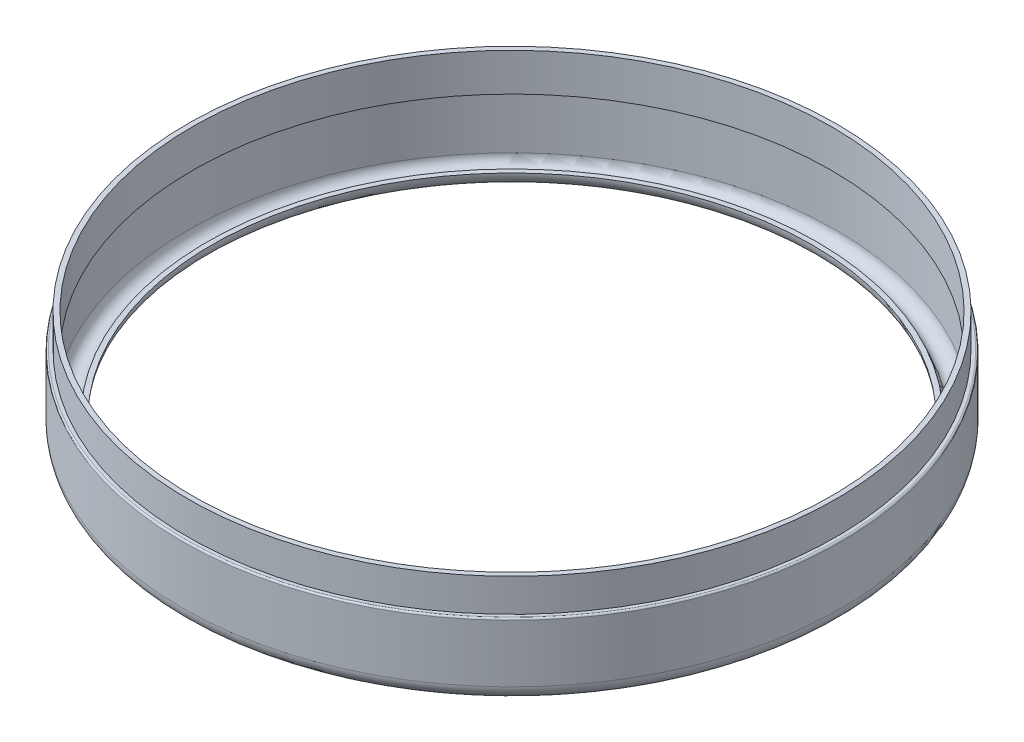
ISO-10303-21;
HEADER;
FILE_DESCRIPTION(('STEP AP214'),'2;1');
FILE_NAME('part.step','',(''),(''),'','','');
FILE_SCHEMA(('AUTOMOTIVE_DESIGN { 1 0 10303 214 1 1 1 1 }'));
ENDSEC;
DATA;
#1=APPLICATION_CONTEXT('core data for automotive mechanical design processes');
#2=APPLICATION_PROTOCOL_DEFINITION('international standard','automotive_design',2000,#1);
#3=PRODUCT_CONTEXT('',#1,'mechanical');
#4=PRODUCT('Part','Part','',(#3));
#5=PRODUCT_RELATED_PRODUCT_CATEGORY('part','',(#4));
#6=PRODUCT_DEFINITION_FORMATION('','',#4);
#7=PRODUCT_DEFINITION_CONTEXT('part definition',#1,'design');
#8=PRODUCT_DEFINITION('design','',#6,#7);
#9=PRODUCT_DEFINITION_SHAPE('','',#8);
#10=(LENGTH_UNIT() NAMED_UNIT(*) SI_UNIT(.MILLI.,.METRE.));
#11=(NAMED_UNIT(*) PLANE_ANGLE_UNIT() SI_UNIT($,.RADIAN.));
#12=(NAMED_UNIT(*) SI_UNIT($,.STERADIAN.) SOLID_ANGLE_UNIT());
#13=UNCERTAINTY_MEASURE_WITH_UNIT(LENGTH_MEASURE(1.E-05),#10,'distance_accuracy_value','');
#14=(GEOMETRIC_REPRESENTATION_CONTEXT(3) GLOBAL_UNCERTAINTY_ASSIGNED_CONTEXT((#13)) GLOBAL_UNIT_ASSIGNED_CONTEXT((#10,
#11,#12)) REPRESENTATION_CONTEXT('',''));
#15=CARTESIAN_POINT('',(0.,0.,0.));
#16=DIRECTION('',(0.,0.,1.));
#17=DIRECTION('',(1.,0.,0.));
#18=AXIS2_PLACEMENT_3D('',#15,#16,#17);
#19=CARTESIAN_POINT('',(0.,-9.00000000000001,0.));
#20=DIRECTION('',(0.,-1.,0.));
#21=DIRECTION('',(0.,0.,-1.));
#22=AXIS2_PLACEMENT_3D('',#19,#20,#21);
#23=TOROIDAL_SURFACE('',#22,95.5,4.5);
#24=CARTESIAN_POINT('',(0.,-9.00000000000001,0.));
#25=DIRECTION('',(0.,-1.,0.));
#26=DIRECTION('',(0.,0.,-1.));
#27=AXIS2_PLACEMENT_3D('',#24,#25,#26);
#28=CIRCLE('',#27,91.);
#29=CARTESIAN_POINT('',(0.,-9.00000000000001,-91.));
#30=VERTEX_POINT('',#29);
#31=EDGE_CURVE('E49',#30,#30,#28,.T.);
#32=ORIENTED_EDGE('',*,*,#31,.F.);
#33=EDGE_LOOP('',(#32));
#34=FACE_BOUND('',#33,.T.);
#35=CARTESIAN_POINT('',(0.,-8.99999999999998,0.));
#36=DIRECTION('',(0.,-1.,0.));
#37=DIRECTION('',(0.,0.,-1.));
#38=AXIS2_PLACEMENT_3D('',#35,#36,#37);
#39=CIRCLE('',#38,100.);
#40=CARTESIAN_POINT('',(0.,-8.99999999999998,-100.));
#41=VERTEX_POINT('',#40);
#42=EDGE_CURVE('E80',#41,#41,#39,.T.);
#43=ORIENTED_EDGE('',*,*,#42,.T.);
#44=EDGE_LOOP('',(#43));
#45=FACE_BOUND('',#44,.T.);
#46=ADVANCED_FACE('F39',(#34,#45),#23,.T.);
#47=CARTESIAN_POINT('',(0.,-9.00000000000001,92.5));
#48=DIRECTION('',(0.,-1.,0.));
#49=DIRECTION('',(0.,0.,-1.));
#50=AXIS2_PLACEMENT_3D('',#47,#48,#49);
#51=PLANE('',#50);
#52=CARTESIAN_POINT('',(0.,-9.00000000000001,0.));
#53=DIRECTION('',(0.,-1.,0.));
#54=DIRECTION('',(0.,0.,-1.));
#55=AXIS2_PLACEMENT_3D('',#52,#53,#54);
#56=CIRCLE('',#55,92.5);
#57=CARTESIAN_POINT('',(0.,-9.00000000000001,-92.5));
#58=VERTEX_POINT('',#57);
#59=EDGE_CURVE('E53',#58,#58,#56,.T.);
#60=ORIENTED_EDGE('',*,*,#59,.F.);
#61=EDGE_LOOP('',(#60));
#62=FACE_BOUND('',#61,.T.);
#63=ORIENTED_EDGE('',*,*,#31,.T.);
#64=EDGE_LOOP('',(#63));
#65=FACE_BOUND('',#64,.T.);
#66=ADVANCED_FACE('F94',(#62,#65),#51,.F.);
#67=CARTESIAN_POINT('',(0.,-9.00000000000001,0.));
#68=DIRECTION('',(0.,-1.,0.));
#69=DIRECTION('',(0.,0.,-1.));
#70=AXIS2_PLACEMENT_3D('',#67,#68,#69);
#71=TOROIDAL_SURFACE('',#70,95.5,3.);
#72=CARTESIAN_POINT('',(0.,-8.99999999999998,0.));
#73=DIRECTION('',(0.,-1.,0.));
#74=DIRECTION('',(0.,0.,-1.));
#75=AXIS2_PLACEMENT_3D('',#72,#73,#74);
#76=CIRCLE('',#75,98.5);
#77=CARTESIAN_POINT('',(0.,-8.99999999999998,-98.5));
#78=VERTEX_POINT('',#77);
#79=EDGE_CURVE('E56',#78,#78,#76,.T.);
#80=ORIENTED_EDGE('',*,*,#79,.F.);
#81=EDGE_LOOP('',(#80));
#82=FACE_BOUND('',#81,.T.);
#83=ORIENTED_EDGE('',*,*,#59,.T.);
#84=EDGE_LOOP('',(#83));
#85=FACE_BOUND('',#84,.T.);
#86=ADVANCED_FACE('F97',(#82,#85),#71,.F.);
#87=CARTESIAN_POINT('',(0.,-178.13693423642,0.));
#88=DIRECTION('',(0.,-1.,0.));
#89=DIRECTION('',(0.,0.,-1.));
#90=AXIS2_PLACEMENT_3D('',#87,#88,#89);
#91=CYLINDRICAL_SURFACE('',#90,98.5);
#92=CARTESIAN_POINT('',(0.,7.50000000000001,0.));
#93=DIRECTION('',(0.,-1.,0.));
#94=DIRECTION('',(0.,0.,-1.));
#95=AXIS2_PLACEMENT_3D('',#92,#93,#94);
#96=CIRCLE('',#95,98.5);
#97=CARTESIAN_POINT('',(0.,7.50000000000001,-98.5));
#98=VERTEX_POINT('',#97);
#99=EDGE_CURVE('E65',#98,#98,#96,.T.);
#100=ORIENTED_EDGE('',*,*,#99,.F.);
#101=EDGE_LOOP('',(#100));
#102=FACE_BOUND('',#101,.T.);
#103=ORIENTED_EDGE('',*,*,#79,.T.);
#104=EDGE_LOOP('',(#103));
#105=FACE_BOUND('',#104,.T.);
#106=ADVANCED_FACE('F106',(#102,#105),#91,.F.);
#107=CARTESIAN_POINT('',(0.,7.50000000000001,98.5));
#108=DIRECTION('',(0.,1.,0.));
#109=DIRECTION('',(0.,0.,1.));
#110=AXIS2_PLACEMENT_3D('',#107,#108,#109);
#111=PLANE('',#110);
#112=CARTESIAN_POINT('',(0.,7.50000000000003,0.));
#113=DIRECTION('',(0.,-1.,0.));
#114=DIRECTION('',(0.,0.,-1.));
#115=AXIS2_PLACEMENT_3D('',#112,#113,#114);
#116=CIRCLE('',#115,97.);
#117=CARTESIAN_POINT('',(0.,7.50000000000003,-97.));
#118=VERTEX_POINT('',#117);
#119=EDGE_CURVE('E63',#118,#118,#116,.T.);
#120=ORIENTED_EDGE('',*,*,#119,.F.);
#121=EDGE_LOOP('',(#120));
#122=FACE_BOUND('',#121,.T.);
#123=ORIENTED_EDGE('',*,*,#99,.T.);
#124=EDGE_LOOP('',(#123));
#125=FACE_BOUND('',#124,.T.);
#126=ADVANCED_FACE('F109',(#122,#125),#111,.F.);
#127=CARTESIAN_POINT('',(0.,-178.13693423642,0.));
#128=DIRECTION('',(0.,-1.,0.));
#129=DIRECTION('',(0.,0.,-1.));
#130=AXIS2_PLACEMENT_3D('',#127,#128,#129);
#131=CYLINDRICAL_SURFACE('',#130,97.);
#132=CARTESIAN_POINT('',(0.,19.,0.));
#133=DIRECTION('',(0.,-1.,0.));
#134=DIRECTION('',(0.,0.,-1.));
#135=AXIS2_PLACEMENT_3D('',#132,#133,#134);
#136=CIRCLE('',#135,97.);
#137=CARTESIAN_POINT('',(0.,19.,-97.));
#138=VERTEX_POINT('',#137);
#139=EDGE_CURVE('E69',#138,#138,#136,.T.);
#140=ORIENTED_EDGE('',*,*,#139,.F.);
#141=EDGE_LOOP('',(#140));
#142=FACE_BOUND('',#141,.T.);
#143=ORIENTED_EDGE('',*,*,#119,.T.);
#144=EDGE_LOOP('',(#143));
#145=FACE_BOUND('',#144,.T.);
#146=ADVANCED_FACE('F111',(#142,#145),#131,.F.);
#147=CARTESIAN_POINT('',(0.,19.,98.5));
#148=DIRECTION('',(0.,-1.,0.));
#149=DIRECTION('',(0.,0.,-1.));
#150=AXIS2_PLACEMENT_3D('',#147,#148,#149);
#151=PLANE('',#150);
#152=CARTESIAN_POINT('',(0.,19.,0.));
#153=DIRECTION('',(0.,-1.,0.));
#154=DIRECTION('',(0.,0.,-1.));
#155=AXIS2_PLACEMENT_3D('',#152,#153,#154);
#156=CIRCLE('',#155,98.5);
#157=CARTESIAN_POINT('',(0.,19.,-98.5));
#158=VERTEX_POINT('',#157);
#159=EDGE_CURVE('E72',#158,#158,#156,.T.);
#160=ORIENTED_EDGE('',*,*,#159,.F.);
#161=EDGE_LOOP('',(#160));
#162=FACE_BOUND('',#161,.T.);
#163=ORIENTED_EDGE('',*,*,#139,.T.);
#164=EDGE_LOOP('',(#163));
#165=FACE_BOUND('',#164,.T.);
#166=ADVANCED_FACE('F119',(#162,#165),#151,.F.);
#167=CARTESIAN_POINT('',(0.,-178.13693423642,0.));
#168=DIRECTION('',(0.,-1.,0.));
#169=DIRECTION('',(0.,0.,-1.));
#170=AXIS2_PLACEMENT_3D('',#167,#168,#169);
#171=CYLINDRICAL_SURFACE('',#170,98.5);
#172=CARTESIAN_POINT('',(0.,9.00000000000004,0.));
#173=DIRECTION('',(0.,-1.,0.));
#174=DIRECTION('',(0.,0.,-1.));
#175=AXIS2_PLACEMENT_3D('',#172,#173,#174);
#176=CIRCLE('',#175,98.5);
#177=CARTESIAN_POINT('',(0.,9.00000000000004,-98.5));
#178=VERTEX_POINT('',#177);
#179=EDGE_CURVE('E74',#178,#178,#176,.T.);
#180=ORIENTED_EDGE('',*,*,#179,.F.);
#181=EDGE_LOOP('',(#180));
#182=FACE_BOUND('',#181,.T.);
#183=ORIENTED_EDGE('',*,*,#159,.T.);
#184=EDGE_LOOP('',(#183));
#185=FACE_BOUND('',#184,.T.);
#186=ADVANCED_FACE('F93',(#182,#185),#171,.T.);
#187=CARTESIAN_POINT('',(0.,9.00000000000001,100.));
#188=DIRECTION('',(0.,-1.,0.));
#189=DIRECTION('',(0.,0.,-1.));
#190=AXIS2_PLACEMENT_3D('',#187,#188,#189);
#191=PLANE('',#190);
#192=CARTESIAN_POINT('',(0.,9.00000000000001,0.));
#193=DIRECTION('',(0.,-1.,0.));
#194=DIRECTION('',(0.,0.,-1.));
#195=AXIS2_PLACEMENT_3D('',#192,#193,#194);
#196=CIRCLE('',#195,99.5);
#197=CARTESIAN_POINT('',(0.,9.00000000000001,-99.5));
#198=VERTEX_POINT('',#197);
#199=EDGE_CURVE('E10',#198,#198,#196,.F.);
#200=ORIENTED_EDGE('',*,*,#199,.T.);
#201=EDGE_LOOP('',(#200));
#202=FACE_BOUND('',#201,.T.);
#203=ORIENTED_EDGE('',*,*,#179,.T.);
#204=EDGE_LOOP('',(#203));
#205=FACE_BOUND('',#204,.T.);
#206=ADVANCED_FACE('F81',(#202,#205),#191,.F.);
#207=CARTESIAN_POINT('',(0.,-178.13693423642,0.));
#208=DIRECTION('',(0.,-1.,0.));
#209=DIRECTION('',(0.,0.,-1.));
#210=AXIS2_PLACEMENT_3D('',#207,#208,#209);
#211=CYLINDRICAL_SURFACE('',#210,100.);
#212=CARTESIAN_POINT('',(0.,8.50000000000001,0.));
#213=DIRECTION('',(0.,-1.,0.));
#214=DIRECTION('',(0.,0.,-1.));
#215=AXIS2_PLACEMENT_3D('',#212,#213,#214);
#216=CIRCLE('',#215,100.);
#217=CARTESIAN_POINT('',(0.,8.50000000000001,-100.));
#218=VERTEX_POINT('',#217);
#219=EDGE_CURVE('E46',#218,#218,#216,.T.);
#220=ORIENTED_EDGE('',*,*,#219,.T.);
#221=EDGE_LOOP('',(#220));
#222=FACE_BOUND('',#221,.T.);
#223=ORIENTED_EDGE('',*,*,#42,.F.);
#224=EDGE_LOOP('',(#223));
#225=FACE_BOUND('',#224,.T.);
#226=ADVANCED_FACE('F85',(#222,#225),#211,.T.);
#227=CARTESIAN_POINT('',(0.,8.50000000000001,0.));
#228=DIRECTION('',(0.,-1.,0.));
#229=DIRECTION('',(0.,0.,-1.));
#230=AXIS2_PLACEMENT_3D('',#227,#228,#229);
#231=TOROIDAL_SURFACE('',#230,99.5,0.5);
#232=ORIENTED_EDGE('',*,*,#199,.F.);
#233=EDGE_LOOP('',(#232));
#234=FACE_BOUND('',#233,.T.);
#235=ORIENTED_EDGE('',*,*,#219,.F.);
#236=EDGE_LOOP('',(#235));
#237=FACE_BOUND('',#236,.T.);
#238=ADVANCED_FACE('F41',(#234,#237),#231,.T.);
#239=CLOSED_SHELL('',(#46,#66,#86,#106,#126,#146,#166,#186,#206,#226,#238));
#240=MANIFOLD_SOLID_BREP('B2',#239);
#241=ADVANCED_BREP_SHAPE_REPRESENTATION('',(#18,#240),#14);
#242=SHAPE_DEFINITION_REPRESENTATION(#9,#241);
ENDSEC;
END-ISO-10303-21;
